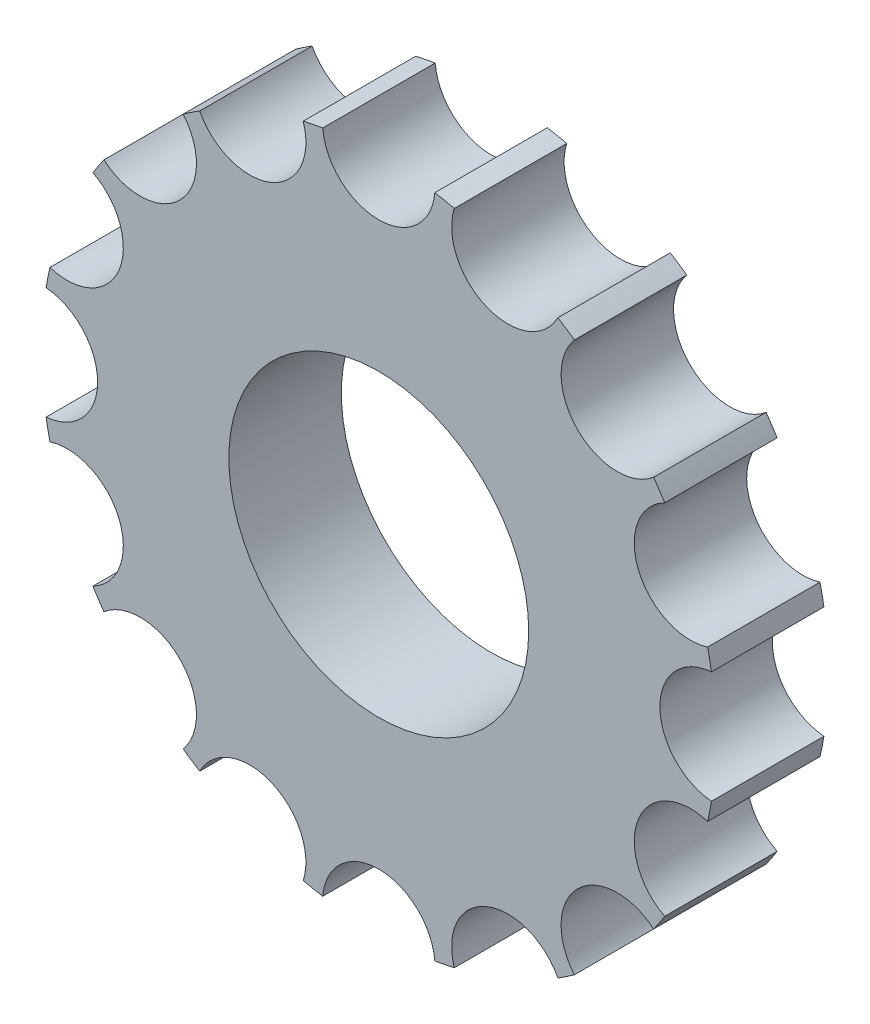
ISO-10303-21;
HEADER;
FILE_DESCRIPTION(('STEP AP214'),'2;1');
FILE_NAME('part.step','',(''),(''),'','','');
FILE_SCHEMA(('AUTOMOTIVE_DESIGN { 1 0 10303 214 1 1 1 1 }'));
ENDSEC;
DATA;
#1=APPLICATION_CONTEXT('core data for automotive mechanical design processes');
#2=APPLICATION_PROTOCOL_DEFINITION('international standard','automotive_design',2000,#1);
#3=PRODUCT_CONTEXT('',#1,'mechanical');
#4=PRODUCT('Part','Part','',(#3));
#5=PRODUCT_RELATED_PRODUCT_CATEGORY('part','',(#4));
#6=PRODUCT_DEFINITION_FORMATION('','',#4);
#7=PRODUCT_DEFINITION_CONTEXT('part definition',#1,'design');
#8=PRODUCT_DEFINITION('design','',#6,#7);
#9=PRODUCT_DEFINITION_SHAPE('','',#8);
#10=(LENGTH_UNIT() NAMED_UNIT(*) SI_UNIT(.MILLI.,.METRE.));
#11=(NAMED_UNIT(*) PLANE_ANGLE_UNIT() SI_UNIT($,.RADIAN.));
#12=(NAMED_UNIT(*) SI_UNIT($,.STERADIAN.) SOLID_ANGLE_UNIT());
#13=UNCERTAINTY_MEASURE_WITH_UNIT(LENGTH_MEASURE(1.E-05),#10,'distance_accuracy_value','');
#14=(GEOMETRIC_REPRESENTATION_CONTEXT(3) GLOBAL_UNCERTAINTY_ASSIGNED_CONTEXT((#13)) GLOBAL_UNIT_ASSIGNED_CONTEXT((#10,
#11,#12)) REPRESENTATION_CONTEXT('',''));
#15=CARTESIAN_POINT('',(0.,0.,0.));
#16=DIRECTION('',(0.,0.,1.));
#17=DIRECTION('',(1.,0.,0.));
#18=AXIS2_PLACEMENT_3D('',#15,#16,#17);
#19=CARTESIAN_POINT('',(0.,0.,15.));
#20=DIRECTION('',(0.,0.,-1.));
#21=DIRECTION('',(-1.,0.,0.));
#22=AXIS2_PLACEMENT_3D('',#19,#20,#21);
#23=CYLINDRICAL_SURFACE('',#22,45.);
#24=CARTESIAN_POINT('',(0.,0.,0.));
#25=DIRECTION('',(0.,0.,1.));
#26=DIRECTION('',(1.,0.,0.));
#27=AXIS2_PLACEMENT_3D('',#24,#25,#26);
#28=CIRCLE('',#27,45.);
#29=CARTESIAN_POINT('',(38.137011588755,23.8865725268229,0.));
#30=VERTEX_POINT('',#29);
#31=CARTESIAN_POINT('',(36.6627179543041,26.0930088760026,0.));
#32=VERTEX_POINT('',#31);
#33=EDGE_CURVE('E383',#30,#32,#28,.T.);
#34=ORIENTED_EDGE('',*,*,#33,.T.);
#35=DIRECTION('',(0.,0.,1.));
#36=VECTOR('',#35,1.);
#37=CARTESIAN_POINT('',(36.6627179543041,26.0930088760026,7.5));
#38=LINE('',#37,#36);
#39=CARTESIAN_POINT('',(36.6627179543041,26.0930088760026,15.));
#40=VERTEX_POINT('',#39);
#41=EDGE_CURVE('E11',#32,#40,#38,.T.);
#42=ORIENTED_EDGE('',*,*,#41,.T.);
#43=CARTESIAN_POINT('',(0.,0.,15.));
#44=DIRECTION('',(0.,0.,1.));
#45=DIRECTION('',(1.,0.,0.));
#46=AXIS2_PLACEMENT_3D('',#43,#44,#45);
#47=CIRCLE('',#46,45.);
#48=CARTESIAN_POINT('',(38.137011588755,23.8865725268229,15.));
#49=VERTEX_POINT('',#48);
#50=EDGE_CURVE('E529',#49,#40,#47,.T.);
#51=ORIENTED_EDGE('',*,*,#50,.F.);
#52=DIRECTION('',(0.,0.,1.));
#53=VECTOR('',#52,1.);
#54=CARTESIAN_POINT('',(38.137011588755,23.8865725268229,7.5));
#55=LINE('',#54,#53);
#56=EDGE_CURVE('E364',#49,#30,#55,.F.);
#57=ORIENTED_EDGE('',*,*,#56,.T.);
#58=EDGE_LOOP('',(#34,#42,#51,#57));
#59=FACE_BOUND('',#58,.T.);
#60=ADVANCED_FACE('F33',(#59),#23,.T.);
#61=CARTESIAN_POINT('',(44.3749999999976,7.47391296445249,0.));
#62=VERTEX_POINT('',#61);
#63=CARTESIAN_POINT('',(43.8572969216168,10.0765820955886,0.));
#64=VERTEX_POINT('',#63);
#65=EDGE_CURVE('E384',#62,#64,#28,.T.);
#66=ORIENTED_EDGE('',*,*,#65,.T.);
#67=DIRECTION('',(0.,0.,1.));
#68=VECTOR('',#67,1.);
#69=CARTESIAN_POINT('',(43.8572969216168,10.0765820955886,7.5));
#70=LINE('',#69,#68);
#71=CARTESIAN_POINT('',(43.8572969216168,10.0765820955886,15.));
#72=VERTEX_POINT('',#71);
#73=EDGE_CURVE('E367',#64,#72,#70,.T.);
#74=ORIENTED_EDGE('',*,*,#73,.T.);
#75=CARTESIAN_POINT('',(44.3749999999976,7.47391296445249,15.));
#76=VERTEX_POINT('',#75);
#77=EDGE_CURVE('E531',#76,#72,#47,.T.);
#78=ORIENTED_EDGE('',*,*,#77,.F.);
#79=DIRECTION('',(0.,0.,1.));
#80=VECTOR('',#79,1.);
#81=CARTESIAN_POINT('',(44.3749999999976,7.47391296445248,7.5));
#82=LINE('',#81,#80);
#83=EDGE_CURVE('E335',#76,#62,#82,.F.);
#84=ORIENTED_EDGE('',*,*,#83,.T.);
#85=EDGE_LOOP('',(#66,#74,#78,#84));
#86=FACE_BOUND('',#85,.T.);
#87=ADVANCED_FACE('F467',(#86),#23,.T.);
#88=CARTESIAN_POINT('',(26.0930088759983,36.6627179543071,15.));
#89=VERTEX_POINT('',#88);
#90=CARTESIAN_POINT('',(23.8865725268151,38.1370115887598,15.));
#91=VERTEX_POINT('',#90);
#92=EDGE_CURVE('E376',#89,#91,#47,.T.);
#93=ORIENTED_EDGE('',*,*,#92,.F.);
#94=DIRECTION('',(0.,0.,1.));
#95=VECTOR('',#94,1.);
#96=CARTESIAN_POINT('',(26.0930088759983,36.6627179543071,7.5));
#97=LINE('',#96,#95);
#98=CARTESIAN_POINT('',(26.0930088759983,36.6627179543071,0.));
#99=VERTEX_POINT('',#98);
#100=EDGE_CURVE('E41',#89,#99,#97,.F.);
#101=ORIENTED_EDGE('',*,*,#100,.T.);
#102=CARTESIAN_POINT('',(23.8865725268151,38.1370115887598,0.));
#103=VERTEX_POINT('',#102);
#104=EDGE_CURVE('E374',#99,#103,#28,.T.);
#105=ORIENTED_EDGE('',*,*,#104,.T.);
#106=DIRECTION('',(0.,0.,1.));
#107=VECTOR('',#106,1.);
#108=CARTESIAN_POINT('',(23.8865725268151,38.1370115887598,7.5));
#109=LINE('',#108,#107);
#110=EDGE_CURVE('E361',#103,#91,#109,.T.);
#111=ORIENTED_EDGE('',*,*,#110,.T.);
#112=EDGE_LOOP('',(#93,#101,#105,#111));
#113=FACE_BOUND('',#112,.T.);
#114=ADVANCED_FACE('F373',(#113),#23,.T.);
#115=CARTESIAN_POINT('',(23.8865725268439,-38.1370115887418,0.));
#116=VERTEX_POINT('',#115);
#117=CARTESIAN_POINT('',(26.0930088760029,-36.6627179543039,0.));
#118=VERTEX_POINT('',#117);
#119=EDGE_CURVE('E476',#116,#118,#28,.T.);
#120=ORIENTED_EDGE('',*,*,#119,.T.);
#121=DIRECTION('',(0.,0.,1.));
#122=VECTOR('',#121,1.);
#123=CARTESIAN_POINT('',(26.0930088760029,-36.6627179543039,7.5));
#124=LINE('',#123,#122);
#125=CARTESIAN_POINT('',(26.0930088760029,-36.6627179543039,15.));
#126=VERTEX_POINT('',#125);
#127=EDGE_CURVE('E356',#118,#126,#124,.T.);
#128=ORIENTED_EDGE('',*,*,#127,.T.);
#129=CARTESIAN_POINT('',(23.8865725268439,-38.1370115887418,15.));
#130=VERTEX_POINT('',#129);
#131=EDGE_CURVE('E541',#130,#126,#47,.T.);
#132=ORIENTED_EDGE('',*,*,#131,.F.);
#133=DIRECTION('',(0.,0.,1.));
#134=VECTOR('',#133,1.);
#135=CARTESIAN_POINT('',(23.8865725268439,-38.1370115887418,7.5));
#136=LINE('',#135,#134);
#137=EDGE_CURVE('E347',#130,#116,#136,.F.);
#138=ORIENTED_EDGE('',*,*,#137,.T.);
#139=EDGE_LOOP('',(#120,#128,#132,#138));
#140=FACE_BOUND('',#139,.T.);
#141=ADVANCED_FACE('F572',(#140),#23,.T.);
#142=CARTESIAN_POINT('',(7.47391296447325,-44.3749999999941,0.));
#143=VERTEX_POINT('',#142);
#144=CARTESIAN_POINT('',(10.0765820955872,-43.8572969216172,0.));
#145=VERTEX_POINT('',#144);
#146=EDGE_CURVE('E480',#143,#145,#28,.T.);
#147=ORIENTED_EDGE('',*,*,#146,.T.);
#148=DIRECTION('',(0.,0.,1.));
#149=VECTOR('',#148,1.);
#150=CARTESIAN_POINT('',(10.0765820955872,-43.8572969216172,7.5));
#151=LINE('',#150,#149);
#152=CARTESIAN_POINT('',(10.0765820955872,-43.8572969216172,15.));
#153=VERTEX_POINT('',#152);
#154=EDGE_CURVE('E350',#145,#153,#151,.T.);
#155=ORIENTED_EDGE('',*,*,#154,.T.);
#156=CARTESIAN_POINT('',(7.47391296447325,-44.3749999999941,15.));
#157=VERTEX_POINT('',#156);
#158=EDGE_CURVE('E545',#157,#153,#47,.T.);
#159=ORIENTED_EDGE('',*,*,#158,.F.);
#160=DIRECTION('',(0.,0.,1.));
#161=VECTOR('',#160,1.);
#162=CARTESIAN_POINT('',(7.47391296447325,-44.3749999999941,7.5));
#163=LINE('',#162,#161);
#164=EDGE_CURVE('E311',#157,#143,#163,.F.);
#165=ORIENTED_EDGE('',*,*,#164,.T.);
#166=EDGE_LOOP('',(#147,#155,#159,#165));
#167=FACE_BOUND('',#166,.T.);
#168=ADVANCED_FACE('F635',(#167),#23,.T.);
#169=CARTESIAN_POINT('',(36.6627179543216,-26.093008875978,15.));
#170=VERTEX_POINT('',#169);
#171=CARTESIAN_POINT('',(38.1370115887609,-23.8865725268133,15.));
#172=VERTEX_POINT('',#171);
#173=EDGE_CURVE('E537',#170,#172,#47,.T.);
#174=ORIENTED_EDGE('',*,*,#173,.F.);
#175=DIRECTION('',(0.,0.,1.));
#176=VECTOR('',#175,1.);
#177=CARTESIAN_POINT('',(36.6627179543216,-26.093008875978,7.5));
#178=LINE('',#177,#176);
#179=CARTESIAN_POINT('',(36.6627179543216,-26.093008875978,0.));
#180=VERTEX_POINT('',#179);
#181=EDGE_CURVE('E353',#170,#180,#178,.F.);
#182=ORIENTED_EDGE('',*,*,#181,.T.);
#183=CARTESIAN_POINT('',(38.1370115887609,-23.8865725268133,0.));
#184=VERTEX_POINT('',#183);
#185=EDGE_CURVE('E472',#180,#184,#28,.T.);
#186=ORIENTED_EDGE('',*,*,#185,.T.);
#187=DIRECTION('',(0.,0.,1.));
#188=VECTOR('',#187,1.);
#189=CARTESIAN_POINT('',(38.1370115887609,-23.8865725268133,7.5));
#190=LINE('',#189,#188);
#191=EDGE_CURVE('E344',#184,#172,#190,.T.);
#192=ORIENTED_EDGE('',*,*,#191,.T.);
#193=EDGE_LOOP('',(#174,#182,#186,#192));
#194=FACE_BOUND('',#193,.T.);
#195=ADVANCED_FACE('F631',(#194),#23,.T.);
#196=CARTESIAN_POINT('',(43.8572969216223,-10.0765820955647,15.));
#197=VERTEX_POINT('',#196);
#198=CARTESIAN_POINT('',(44.3750000000006,-7.47391296443484,15.));
#199=VERTEX_POINT('',#198);
#200=EDGE_CURVE('E534',#197,#199,#47,.T.);
#201=ORIENTED_EDGE('',*,*,#200,.F.);
#202=DIRECTION('',(0.,0.,1.));
#203=VECTOR('',#202,1.);
#204=CARTESIAN_POINT('',(43.8572969216223,-10.0765820955647,7.5));
#205=LINE('',#204,#203);
#206=CARTESIAN_POINT('',(43.8572969216223,-10.0765820955647,0.));
#207=VERTEX_POINT('',#206);
#208=EDGE_CURVE('E341',#197,#207,#205,.F.);
#209=ORIENTED_EDGE('',*,*,#208,.T.);
#210=CARTESIAN_POINT('',(44.3750000000006,-7.47391296443484,0.));
#211=VERTEX_POINT('',#210);
#212=EDGE_CURVE('E470',#207,#211,#28,.T.);
#213=ORIENTED_EDGE('',*,*,#212,.T.);
#214=DIRECTION('',(0.,0.,1.));
#215=VECTOR('',#214,1.);
#216=CARTESIAN_POINT('',(44.3750000000006,-7.47391296443484,7.5));
#217=LINE('',#216,#215);
#218=EDGE_CURVE('E338',#211,#199,#217,.T.);
#219=ORIENTED_EDGE('',*,*,#218,.T.);
#220=EDGE_LOOP('',(#201,#209,#213,#219));
#221=FACE_BOUND('',#220,.T.);
#222=ADVANCED_FACE('F577',(#221),#23,.T.);
#223=CARTESIAN_POINT('',(-38.1370115887443,-23.8865725268398,0.));
#224=VERTEX_POINT('',#223);
#225=CARTESIAN_POINT('',(-36.6627179543067,-26.0930088759989,0.));
#226=VERTEX_POINT('',#225);
#227=EDGE_CURVE('E492',#224,#226,#28,.T.);
#228=ORIENTED_EDGE('',*,*,#227,.T.);
#229=DIRECTION('',(0.,0.,1.));
#230=VECTOR('',#229,1.);
#231=CARTESIAN_POINT('',(-36.6627179543067,-26.0930088759989,7.5));
#232=LINE('',#231,#230);
#233=CARTESIAN_POINT('',(-36.6627179543067,-26.0930088759989,15.));
#234=VERTEX_POINT('',#233);
#235=EDGE_CURVE('E332',#226,#234,#232,.T.);
#236=ORIENTED_EDGE('',*,*,#235,.T.);
#237=CARTESIAN_POINT('',(-38.1370115887443,-23.8865725268398,15.));
#238=VERTEX_POINT('',#237);
#239=EDGE_CURVE('E275',#238,#234,#47,.T.);
#240=ORIENTED_EDGE('',*,*,#239,.F.);
#241=DIRECTION('',(0.,0.,1.));
#242=VECTOR('',#241,1.);
#243=CARTESIAN_POINT('',(-38.1370115887443,-23.8865725268398,7.5));
#244=LINE('',#243,#242);
#245=EDGE_CURVE('E323',#238,#224,#244,.F.);
#246=ORIENTED_EDGE('',*,*,#245,.T.);
#247=EDGE_LOOP('',(#228,#236,#240,#246));
#248=FACE_BOUND('',#247,.T.);
#249=ADVANCED_FACE('F562',(#248),#23,.T.);
#250=CARTESIAN_POINT('',(-44.3749999999964,-7.47391296445945,0.));
#251=VERTEX_POINT('',#250);
#252=CARTESIAN_POINT('',(-43.8572969216182,-10.0765820955825,0.));
#253=VERTEX_POINT('',#252);
#254=EDGE_CURVE('E496',#251,#253,#28,.T.);
#255=ORIENTED_EDGE('',*,*,#254,.T.);
#256=DIRECTION('',(0.,0.,1.));
#257=VECTOR('',#256,1.);
#258=CARTESIAN_POINT('',(-43.8572969216182,-10.0765820955825,7.5));
#259=LINE('',#258,#257);
#260=CARTESIAN_POINT('',(-43.8572969216182,-10.0765820955825,15.));
#261=VERTEX_POINT('',#260);
#262=EDGE_CURVE('E326',#253,#261,#259,.T.);
#263=ORIENTED_EDGE('',*,*,#262,.T.);
#264=CARTESIAN_POINT('',(-44.3749999999964,-7.47391296445945,15.));
#265=VERTEX_POINT('',#264);
#266=EDGE_CURVE('E272',#265,#261,#47,.T.);
#267=ORIENTED_EDGE('',*,*,#266,.F.);
#268=DIRECTION('',(0.,0.,1.));
#269=VECTOR('',#268,1.);
#270=CARTESIAN_POINT('',(-44.3749999999964,-7.47391296445945,7.5));
#271=LINE('',#270,#269);
#272=EDGE_CURVE('E247',#265,#251,#271,.F.);
#273=ORIENTED_EDGE('',*,*,#272,.T.);
#274=EDGE_LOOP('',(#255,#263,#267,#273));
#275=FACE_BOUND('',#274,.T.);
#276=ADVANCED_FACE('F621',(#275),#23,.T.);
#277=CARTESIAN_POINT('',(-26.093008875974,-36.6627179543244,15.));
#278=VERTEX_POINT('',#277);
#279=CARTESIAN_POINT('',(-23.886572526817,-38.1370115887586,15.));
#280=VERTEX_POINT('',#279);
#281=EDGE_CURVE('E553',#278,#280,#47,.T.);
#282=ORIENTED_EDGE('',*,*,#281,.F.);
#283=DIRECTION('',(0.,0.,1.));
#284=VECTOR('',#283,1.);
#285=CARTESIAN_POINT('',(-26.093008875974,-36.6627179543244,7.5));
#286=LINE('',#285,#284);
#287=CARTESIAN_POINT('',(-26.093008875974,-36.6627179543244,0.));
#288=VERTEX_POINT('',#287);
#289=EDGE_CURVE('E329',#278,#288,#286,.F.);
#290=ORIENTED_EDGE('',*,*,#289,.T.);
#291=CARTESIAN_POINT('',(-23.886572526817,-38.1370115887586,0.));
#292=VERTEX_POINT('',#291);
#293=EDGE_CURVE('E488',#288,#292,#28,.T.);
#294=ORIENTED_EDGE('',*,*,#293,.T.);
#295=DIRECTION('',(0.,0.,1.));
#296=VECTOR('',#295,1.);
#297=CARTESIAN_POINT('',(-23.886572526817,-38.1370115887586,7.5));
#298=LINE('',#297,#296);
#299=EDGE_CURVE('E320',#292,#280,#298,.T.);
#300=ORIENTED_EDGE('',*,*,#299,.T.);
#301=EDGE_LOOP('',(#282,#290,#294,#300));
#302=FACE_BOUND('',#301,.T.);
#303=ADVANCED_FACE('F617',(#302),#23,.T.);
#304=CARTESIAN_POINT('',(-10.076582095551,-43.8572969216255,15.));
#305=VERTEX_POINT('',#304);
#306=CARTESIAN_POINT('',(-7.47391296443796,-44.3750000000001,15.));
#307=VERTEX_POINT('',#306);
#308=EDGE_CURVE('E549',#305,#307,#47,.T.);
#309=ORIENTED_EDGE('',*,*,#308,.F.);
#310=DIRECTION('',(0.,0.,1.));
#311=VECTOR('',#310,1.);
#312=CARTESIAN_POINT('',(-10.076582095551,-43.8572969216255,7.5));
#313=LINE('',#312,#311);
#314=CARTESIAN_POINT('',(-10.076582095551,-43.8572969216255,0.));
#315=VERTEX_POINT('',#314);
#316=EDGE_CURVE('E317',#305,#315,#313,.F.);
#317=ORIENTED_EDGE('',*,*,#316,.T.);
#318=CARTESIAN_POINT('',(-7.47391296443796,-44.3750000000001,0.));
#319=VERTEX_POINT('',#318);
#320=EDGE_CURVE('E484',#315,#319,#28,.T.);
#321=ORIENTED_EDGE('',*,*,#320,.T.);
#322=DIRECTION('',(0.,0.,1.));
#323=VECTOR('',#322,1.);
#324=CARTESIAN_POINT('',(-7.47391296443796,-44.3750000000001,7.5));
#325=LINE('',#324,#323);
#326=EDGE_CURVE('E314',#319,#307,#325,.T.);
#327=ORIENTED_EDGE('',*,*,#326,.T.);
#328=EDGE_LOOP('',(#309,#317,#321,#327));
#329=FACE_BOUND('',#328,.T.);
#330=ADVANCED_FACE('F567',(#329),#23,.T.);
#331=CARTESIAN_POINT('',(-23.886572526819,38.1370115887574,0.));
#332=VERTEX_POINT('',#331);
#333=CARTESIAN_POINT('',(-26.0930088759983,36.6627179543071,0.));
#334=VERTEX_POINT('',#333);
#335=EDGE_CURVE('E287',#332,#334,#28,.T.);
#336=ORIENTED_EDGE('',*,*,#335,.T.);
#337=DIRECTION('',(0.,0.,1.));
#338=VECTOR('',#337,1.);
#339=CARTESIAN_POINT('',(-26.0930088759983,36.6627179543071,7.5));
#340=LINE('',#339,#338);
#341=CARTESIAN_POINT('',(-26.0930088759983,36.6627179543071,15.));
#342=VERTEX_POINT('',#341);
#343=EDGE_CURVE('E308',#334,#342,#340,.T.);
#344=ORIENTED_EDGE('',*,*,#343,.T.);
#345=CARTESIAN_POINT('',(-23.886572526819,38.1370115887574,15.));
#346=VERTEX_POINT('',#345);
#347=EDGE_CURVE('E274',#346,#342,#47,.T.);
#348=ORIENTED_EDGE('',*,*,#347,.F.);
#349=DIRECTION('',(0.,0.,1.));
#350=VECTOR('',#349,1.);
#351=CARTESIAN_POINT('',(-23.886572526819,38.1370115887574,7.5));
#352=LINE('',#351,#350);
#353=EDGE_CURVE('E299',#346,#332,#352,.F.);
#354=ORIENTED_EDGE('',*,*,#353,.T.);
#355=EDGE_LOOP('',(#336,#344,#348,#354));
#356=FACE_BOUND('',#355,.T.);
#357=ADVANCED_FACE('F509',(#356),#23,.T.);
#358=CARTESIAN_POINT('',(-7.47391296443837,44.375,0.));
#359=VERTEX_POINT('',#358);
#360=CARTESIAN_POINT('',(-10.0765820955837,43.857296921618,0.));
#361=VERTEX_POINT('',#360);
#362=EDGE_CURVE('E284',#359,#361,#28,.T.);
#363=ORIENTED_EDGE('',*,*,#362,.T.);
#364=DIRECTION('',(0.,0.,1.));
#365=VECTOR('',#364,1.);
#366=CARTESIAN_POINT('',(-10.0765820955837,43.857296921618,7.5));
#367=LINE('',#366,#365);
#368=CARTESIAN_POINT('',(-10.0765820955837,43.857296921618,15.));
#369=VERTEX_POINT('',#368);
#370=EDGE_CURVE('E302',#361,#369,#367,.T.);
#371=ORIENTED_EDGE('',*,*,#370,.T.);
#372=CARTESIAN_POINT('',(-7.47391296443837,44.375,15.));
#373=VERTEX_POINT('',#372);
#374=EDGE_CURVE('E276',#373,#369,#47,.T.);
#375=ORIENTED_EDGE('',*,*,#374,.F.);
#376=DIRECTION('',(0.,0.,1.));
#377=VECTOR('',#376,1.);
#378=CARTESIAN_POINT('',(-7.47391296443837,44.375,7.5));
#379=LINE('',#378,#377);
#380=EDGE_CURVE('E280',#373,#359,#379,.F.);
#381=ORIENTED_EDGE('',*,*,#380,.T.);
#382=EDGE_LOOP('',(#363,#371,#375,#381));
#383=FACE_BOUND('',#382,.T.);
#384=ADVANCED_FACE('F524',(#383),#23,.T.);
#385=CARTESIAN_POINT('',(-36.6627179543101,26.093008875994,15.));
#386=VERTEX_POINT('',#385);
#387=CARTESIAN_POINT('',(-38.1370115887573,23.8865725268191,15.));
#388=VERTEX_POINT('',#387);
#389=EDGE_CURVE('E271',#386,#388,#47,.T.);
#390=ORIENTED_EDGE('',*,*,#389,.F.);
#391=DIRECTION('',(0.,0.,1.));
#392=VECTOR('',#391,1.);
#393=CARTESIAN_POINT('',(-36.6627179543101,26.093008875994,7.5));
#394=LINE('',#393,#392);
#395=CARTESIAN_POINT('',(-36.6627179543101,26.093008875994,0.));
#396=VERTEX_POINT('',#395);
#397=EDGE_CURVE('E305',#386,#396,#394,.F.);
#398=ORIENTED_EDGE('',*,*,#397,.T.);
#399=CARTESIAN_POINT('',(-38.1370115887573,23.8865725268191,0.));
#400=VERTEX_POINT('',#399);
#401=EDGE_CURVE('E502',#396,#400,#28,.T.);
#402=ORIENTED_EDGE('',*,*,#401,.T.);
#403=DIRECTION('',(0.,0.,1.));
#404=VECTOR('',#403,1.);
#405=CARTESIAN_POINT('',(-38.1370115887573,23.8865725268191,7.5));
#406=LINE('',#405,#404);
#407=EDGE_CURVE('E296',#400,#388,#406,.T.);
#408=ORIENTED_EDGE('',*,*,#407,.T.);
#409=EDGE_LOOP('',(#390,#398,#402,#408));
#410=FACE_BOUND('',#409,.T.);
#411=ADVANCED_FACE('F517',(#410),#23,.T.);
#412=CARTESIAN_POINT('',(-43.8572969216208,10.0765820955715,15.));
#413=VERTEX_POINT('',#412);
#414=CARTESIAN_POINT('',(-44.3749999999994,7.47391296444179,15.));
#415=VERTEX_POINT('',#414);
#416=EDGE_CURVE('E260',#413,#415,#47,.T.);
#417=ORIENTED_EDGE('',*,*,#416,.F.);
#418=DIRECTION('',(0.,0.,1.));
#419=VECTOR('',#418,1.);
#420=CARTESIAN_POINT('',(-43.8572969216208,10.0765820955715,7.5));
#421=LINE('',#420,#419);
#422=CARTESIAN_POINT('',(-43.8572969216208,10.0765820955715,0.));
#423=VERTEX_POINT('',#422);
#424=EDGE_CURVE('E263',#413,#423,#421,.F.);
#425=ORIENTED_EDGE('',*,*,#424,.T.);
#426=CARTESIAN_POINT('',(-44.3749999999994,7.47391296444179,0.));
#427=VERTEX_POINT('',#426);
#428=EDGE_CURVE('E262',#423,#427,#28,.T.);
#429=ORIENTED_EDGE('',*,*,#428,.T.);
#430=DIRECTION('',(0.,0.,1.));
#431=VECTOR('',#430,1.);
#432=CARTESIAN_POINT('',(-44.3749999999994,7.47391296444179,7.5));
#433=LINE('',#432,#431);
#434=EDGE_CURVE('E244',#427,#415,#433,.T.);
#435=ORIENTED_EDGE('',*,*,#434,.T.);
#436=EDGE_LOOP('',(#417,#425,#429,#435));
#437=FACE_BOUND('',#436,.T.);
#438=ADVANCED_FACE('F258',(#437),#23,.T.);
#439=CARTESIAN_POINT('',(0.,0.,15.));
#440=DIRECTION('',(0.,0.,1.));
#441=DIRECTION('',(1.,0.,0.));
#442=AXIS2_PLACEMENT_3D('',#439,#440,#441);
#443=PLANE('',#442);
#444=CARTESIAN_POINT('',(31.8198051533973,31.819805153401,15.));
#445=DIRECTION('',(0.,0.,1.));
#446=DIRECTION('',(1.,0.,0.));
#447=AXIS2_PLACEMENT_3D('',#444,#445,#446);
#448=CIRCLE('',#447,7.50000000000073);
#449=EDGE_CURVE('E457',#89,#40,#448,.T.);
#450=ORIENTED_EDGE('',*,*,#449,.F.);
#451=ORIENTED_EDGE('',*,*,#92,.T.);
#452=CARTESIAN_POINT('',(17.2207544564297,41.5745789630113,15.));
#453=DIRECTION('',(0.,0.,1.));
#454=DIRECTION('',(1.,0.,0.));
#455=AXIS2_PLACEMENT_3D('',#452,#453,#454);
#456=CIRCLE('',#455,7.49999999999971);
#457=CARTESIAN_POINT('',(10.0765820955854,43.8572969216176,15.));
#458=VERTEX_POINT('',#457);
#459=EDGE_CURVE('E454',#458,#91,#456,.T.);
#460=ORIENTED_EDGE('',*,*,#459,.F.);
#461=CARTESIAN_POINT('',(7.47391296443837,44.375,15.));
#462=VERTEX_POINT('',#461);
#463=EDGE_CURVE('E281',#458,#462,#47,.T.);
#464=ORIENTED_EDGE('',*,*,#463,.T.);
#465=CARTESIAN_POINT('',(0.,45.,15.));
#466=DIRECTION('',(0.,0.,1.));
#467=DIRECTION('',(1.,0.,0.));
#468=AXIS2_PLACEMENT_3D('',#465,#466,#467);
#469=CIRCLE('',#468,7.5);
#470=EDGE_CURVE('E394',#373,#462,#469,.T.);
#471=ORIENTED_EDGE('',*,*,#470,.F.);
#472=ORIENTED_EDGE('',*,*,#374,.T.);
#473=CARTESIAN_POINT('',(-17.2207544564284,41.5745789630045,15.));
#474=DIRECTION('',(0.,0.,1.));
#475=DIRECTION('',(1.,0.,0.));
#476=AXIS2_PLACEMENT_3D('',#473,#474,#475);
#477=CIRCLE('',#476,7.50000000000227);
#478=EDGE_CURVE('E410',#346,#369,#477,.T.);
#479=ORIENTED_EDGE('',*,*,#478,.F.);
#480=ORIENTED_EDGE('',*,*,#347,.T.);
#481=CARTESIAN_POINT('',(-31.819805153392,31.8198051533883,15.));
#482=DIRECTION('',(0.,0.,1.));
#483=DIRECTION('',(1.,0.,0.));
#484=AXIS2_PLACEMENT_3D('',#481,#482,#483);
#485=CIRCLE('',#484,7.50000000000489);
#486=EDGE_CURVE('E405',#386,#342,#485,.T.);
#487=ORIENTED_EDGE('',*,*,#486,.F.);
#488=ORIENTED_EDGE('',*,*,#389,.T.);
#489=CARTESIAN_POINT('',(-41.5745789630024,17.2207544564208,15.));
#490=DIRECTION('',(0.,0.,1.));
#491=DIRECTION('',(1.,0.,0.));
#492=AXIS2_PLACEMENT_3D('',#489,#490,#491);
#493=CIRCLE('',#492,7.50000000000815);
#494=EDGE_CURVE('E270',#413,#388,#493,.T.);
#495=ORIENTED_EDGE('',*,*,#494,.F.);
#496=ORIENTED_EDGE('',*,*,#416,.T.);
#497=CARTESIAN_POINT('',(-44.999999999991,-8.95283847057726E-12,15.));
#498=DIRECTION('',(0.,0.,1.));
#499=DIRECTION('',(1.,0.,0.));
#500=AXIS2_PLACEMENT_3D('',#497,#498,#499);
#501=CIRCLE('',#500,7.50000000001163);
#502=EDGE_CURVE('E241',#265,#415,#501,.T.);
#503=ORIENTED_EDGE('',*,*,#502,.F.);
#504=ORIENTED_EDGE('',*,*,#266,.T.);
#505=CARTESIAN_POINT('',(-41.5745789629955,-17.2207544564373,15.));
#506=DIRECTION('',(0.,0.,1.));
#507=DIRECTION('',(1.,0.,0.));
#508=AXIS2_PLACEMENT_3D('',#505,#506,#507);
#509=CIRCLE('',#508,7.50000000001471);
#510=EDGE_CURVE('E404',#238,#261,#509,.T.);
#511=ORIENTED_EDGE('',*,*,#510,.F.);
#512=ORIENTED_EDGE('',*,*,#239,.T.);
#513=CARTESIAN_POINT('',(-31.8198051533794,-31.819805153401,15.));
#514=DIRECTION('',(0.,0.,1.));
#515=DIRECTION('',(1.,0.,0.));
#516=AXIS2_PLACEMENT_3D('',#513,#514,#515);
#517=CIRCLE('',#516,7.50000000001683);
#518=EDGE_CURVE('E426',#278,#234,#517,.T.);
#519=ORIENTED_EDGE('',*,*,#518,.F.);
#520=ORIENTED_EDGE('',*,*,#281,.T.);
#521=CARTESIAN_POINT('',(-17.2207544564118,-41.5745789630113,15.));
#522=DIRECTION('',(0.,0.,1.));
#523=DIRECTION('',(1.,0.,0.));
#524=AXIS2_PLACEMENT_3D('',#521,#522,#523);
#525=CIRCLE('',#524,7.50000000001781);
#526=EDGE_CURVE('E414',#305,#280,#525,.T.);
#527=ORIENTED_EDGE('',*,*,#526,.F.);
#528=ORIENTED_EDGE('',*,*,#308,.T.);
#529=CARTESIAN_POINT('',(1.78946551199622E-11,-45.,15.));
#530=DIRECTION('',(0.,0.,1.));
#531=DIRECTION('',(1.,0.,0.));
#532=AXIS2_PLACEMENT_3D('',#529,#530,#531);
#533=CIRCLE('',#532,7.50000000001741);
#534=EDGE_CURVE('E420',#157,#307,#533,.T.);
#535=ORIENTED_EDGE('',*,*,#534,.F.);
#536=ORIENTED_EDGE('',*,*,#158,.T.);
#537=CARTESIAN_POINT('',(17.2207544564463,-41.5745789630045,15.));
#538=DIRECTION('',(0.,0.,1.));
#539=DIRECTION('',(1.,0.,0.));
#540=AXIS2_PLACEMENT_3D('',#537,#538,#539);
#541=CIRCLE('',#540,7.50000000001572);
#542=EDGE_CURVE('E425',#130,#153,#541,.T.);
#543=ORIENTED_EDGE('',*,*,#542,.F.);
#544=ORIENTED_EDGE('',*,*,#131,.T.);
#545=CARTESIAN_POINT('',(31.8198051534099,-31.8198051533883,15.));
#546=DIRECTION('',(0.,0.,1.));
#547=DIRECTION('',(1.,0.,0.));
#548=AXIS2_PLACEMENT_3D('',#545,#546,#547);
#549=CIRCLE('',#548,7.50000000001298);
#550=EDGE_CURVE('E446',#170,#126,#549,.T.);
#551=ORIENTED_EDGE('',*,*,#550,.F.);
#552=ORIENTED_EDGE('',*,*,#173,.T.);
#553=CARTESIAN_POINT('',(41.5745789630203,-17.2207544564208,15.));
#554=DIRECTION('',(0.,0.,1.));
#555=DIRECTION('',(1.,0.,0.));
#556=AXIS2_PLACEMENT_3D('',#553,#554,#555);
#557=CIRCLE('',#556,7.5000000000096);
#558=EDGE_CURVE('E434',#197,#172,#557,.T.);
#559=ORIENTED_EDGE('',*,*,#558,.F.);
#560=ORIENTED_EDGE('',*,*,#200,.T.);
#561=CARTESIAN_POINT('',(45.0000000000089,8.9473275599811E-12,15.));
#562=DIRECTION('',(0.,0.,1.));
#563=DIRECTION('',(1.,0.,0.));
#564=AXIS2_PLACEMENT_3D('',#561,#562,#563);
#565=CIRCLE('',#564,7.50000000000609);
#566=EDGE_CURVE('E440',#76,#199,#565,.T.);
#567=ORIENTED_EDGE('',*,*,#566,.F.);
#568=ORIENTED_EDGE('',*,*,#77,.T.);
#569=CARTESIAN_POINT('',(41.5745789630134,17.2207544564373,15.));
#570=DIRECTION('',(0.,0.,1.));
#571=DIRECTION('',(1.,0.,0.));
#572=AXIS2_PLACEMENT_3D('',#569,#570,#571);
#573=CIRCLE('',#572,7.50000000000298);
#574=EDGE_CURVE('E445',#49,#72,#573,.T.);
#575=ORIENTED_EDGE('',*,*,#574,.F.);
#576=ORIENTED_EDGE('',*,*,#50,.T.);
#577=EDGE_LOOP('',(#450,#451,#460,#464,#471,#472,#479,#480,#487,#488,#495,#496,#503,#504,#511,
#512,#519,#520,#527,#528,#535,#536,#543,#544,#551,#552,#559,#560,#567,#568,#575,#576));
#578=FACE_BOUND('',#577,.T.);
#579=CARTESIAN_POINT('',(0.,0.,15.));
#580=DIRECTION('',(0.,0.,1.));
#581=DIRECTION('',(1.,0.,0.));
#582=AXIS2_PLACEMENT_3D('',#579,#580,#581);
#583=CIRCLE('',#582,20.);
#584=CARTESIAN_POINT('',(20.,0.,15.));
#585=VERTEX_POINT('',#584);
#586=EDGE_CURVE('E385',#585,#585,#583,.T.);
#587=ORIENTED_EDGE('',*,*,#586,.F.);
#588=EDGE_LOOP('',(#587));
#589=FACE_BOUND('',#588,.T.);
#590=ADVANCED_FACE('F267',(#578,#589),#443,.T.);
#591=CARTESIAN_POINT('',(0.,0.,0.));
#592=DIRECTION('',(0.,0.,1.));
#593=DIRECTION('',(1.,0.,0.));
#594=AXIS2_PLACEMENT_3D('',#591,#592,#593);
#595=PLANE('',#594);
#596=ORIENTED_EDGE('',*,*,#104,.F.);
#597=CARTESIAN_POINT('',(31.8198051533973,31.819805153401,0.));
#598=DIRECTION('',(0.,0.,1.));
#599=DIRECTION('',(1.,0.,0.));
#600=AXIS2_PLACEMENT_3D('',#597,#598,#599);
#601=CIRCLE('',#600,7.50000000000073);
#602=EDGE_CURVE('E56',#99,#32,#601,.T.);
#603=ORIENTED_EDGE('',*,*,#602,.T.);
#604=ORIENTED_EDGE('',*,*,#33,.F.);
#605=CARTESIAN_POINT('',(41.5745789630134,17.2207544564373,0.));
#606=DIRECTION('',(0.,0.,1.));
#607=DIRECTION('',(1.,0.,0.));
#608=AXIS2_PLACEMENT_3D('',#605,#606,#607);
#609=CIRCLE('',#608,7.50000000000298);
#610=EDGE_CURVE('E459',#30,#64,#609,.T.);
#611=ORIENTED_EDGE('',*,*,#610,.T.);
#612=ORIENTED_EDGE('',*,*,#65,.F.);
#613=CARTESIAN_POINT('',(45.0000000000089,8.9473275599811E-12,0.));
#614=DIRECTION('',(0.,0.,1.));
#615=DIRECTION('',(1.,0.,0.));
#616=AXIS2_PLACEMENT_3D('',#613,#614,#615);
#617=CIRCLE('',#616,7.50000000000609);
#618=EDGE_CURVE('E442',#62,#211,#617,.T.);
#619=ORIENTED_EDGE('',*,*,#618,.T.);
#620=ORIENTED_EDGE('',*,*,#212,.F.);
#621=CARTESIAN_POINT('',(41.5745789630203,-17.2207544564208,0.));
#622=DIRECTION('',(0.,0.,1.));
#623=DIRECTION('',(1.,0.,0.));
#624=AXIS2_PLACEMENT_3D('',#621,#622,#623);
#625=CIRCLE('',#624,7.5000000000096);
#626=EDGE_CURVE('E436',#207,#184,#625,.T.);
#627=ORIENTED_EDGE('',*,*,#626,.T.);
#628=ORIENTED_EDGE('',*,*,#185,.F.);
#629=CARTESIAN_POINT('',(31.8198051534099,-31.8198051533883,0.));
#630=DIRECTION('',(0.,0.,1.));
#631=DIRECTION('',(1.,0.,0.));
#632=AXIS2_PLACEMENT_3D('',#629,#630,#631);
#633=CIRCLE('',#632,7.50000000001298);
#634=EDGE_CURVE('E437',#180,#118,#633,.T.);
#635=ORIENTED_EDGE('',*,*,#634,.T.);
#636=ORIENTED_EDGE('',*,*,#119,.F.);
#637=CARTESIAN_POINT('',(17.2207544564463,-41.5745789630045,0.));
#638=DIRECTION('',(0.,0.,1.));
#639=DIRECTION('',(1.,0.,0.));
#640=AXIS2_PLACEMENT_3D('',#637,#638,#639);
#641=CIRCLE('',#640,7.50000000001572);
#642=EDGE_CURVE('E448',#116,#145,#641,.T.);
#643=ORIENTED_EDGE('',*,*,#642,.T.);
#644=ORIENTED_EDGE('',*,*,#146,.F.);
#645=CARTESIAN_POINT('',(1.78946551199622E-11,-45.,0.));
#646=DIRECTION('',(0.,0.,1.));
#647=DIRECTION('',(1.,0.,0.));
#648=AXIS2_PLACEMENT_3D('',#645,#646,#647);
#649=CIRCLE('',#648,7.50000000001741);
#650=EDGE_CURVE('E422',#143,#319,#649,.T.);
#651=ORIENTED_EDGE('',*,*,#650,.T.);
#652=ORIENTED_EDGE('',*,*,#320,.F.);
#653=CARTESIAN_POINT('',(-17.2207544564118,-41.5745789630113,0.));
#654=DIRECTION('',(0.,0.,1.));
#655=DIRECTION('',(1.,0.,0.));
#656=AXIS2_PLACEMENT_3D('',#653,#654,#655);
#657=CIRCLE('',#656,7.50000000001781);
#658=EDGE_CURVE('E416',#315,#292,#657,.T.);
#659=ORIENTED_EDGE('',*,*,#658,.T.);
#660=ORIENTED_EDGE('',*,*,#293,.F.);
#661=CARTESIAN_POINT('',(-31.8198051533794,-31.819805153401,0.));
#662=DIRECTION('',(0.,0.,1.));
#663=DIRECTION('',(1.,0.,0.));
#664=AXIS2_PLACEMENT_3D('',#661,#662,#663);
#665=CIRCLE('',#664,7.50000000001683);
#666=EDGE_CURVE('E417',#288,#226,#665,.T.);
#667=ORIENTED_EDGE('',*,*,#666,.T.);
#668=ORIENTED_EDGE('',*,*,#227,.F.);
#669=CARTESIAN_POINT('',(-41.5745789629955,-17.2207544564373,0.));
#670=DIRECTION('',(0.,0.,1.));
#671=DIRECTION('',(1.,0.,0.));
#672=AXIS2_PLACEMENT_3D('',#669,#670,#671);
#673=CIRCLE('',#672,7.50000000001471);
#674=EDGE_CURVE('E428',#224,#253,#673,.T.);
#675=ORIENTED_EDGE('',*,*,#674,.T.);
#676=ORIENTED_EDGE('',*,*,#254,.F.);
#677=CARTESIAN_POINT('',(-44.999999999991,-8.95283847057726E-12,0.));
#678=DIRECTION('',(0.,0.,1.));
#679=DIRECTION('',(1.,0.,0.));
#680=AXIS2_PLACEMENT_3D('',#677,#678,#679);
#681=CIRCLE('',#680,7.50000000001163);
#682=EDGE_CURVE('E252',#251,#427,#681,.T.);
#683=ORIENTED_EDGE('',*,*,#682,.T.);
#684=ORIENTED_EDGE('',*,*,#428,.F.);
#685=CARTESIAN_POINT('',(-41.5745789630024,17.2207544564208,0.));
#686=DIRECTION('',(0.,0.,1.));
#687=DIRECTION('',(1.,0.,0.));
#688=AXIS2_PLACEMENT_3D('',#685,#686,#687);
#689=CIRCLE('',#688,7.50000000000815);
#690=EDGE_CURVE('E253',#423,#400,#689,.T.);
#691=ORIENTED_EDGE('',*,*,#690,.T.);
#692=ORIENTED_EDGE('',*,*,#401,.F.);
#693=CARTESIAN_POINT('',(-31.819805153392,31.8198051533883,0.));
#694=DIRECTION('',(0.,0.,1.));
#695=DIRECTION('',(1.,0.,0.));
#696=AXIS2_PLACEMENT_3D('',#693,#694,#695);
#697=CIRCLE('',#696,7.50000000000489);
#698=EDGE_CURVE('E400',#396,#334,#697,.T.);
#699=ORIENTED_EDGE('',*,*,#698,.T.);
#700=ORIENTED_EDGE('',*,*,#335,.F.);
#701=CARTESIAN_POINT('',(-17.2207544564284,41.5745789630045,0.));
#702=DIRECTION('',(0.,0.,1.));
#703=DIRECTION('',(1.,0.,0.));
#704=AXIS2_PLACEMENT_3D('',#701,#702,#703);
#705=CIRCLE('',#704,7.50000000000227);
#706=EDGE_CURVE('E407',#332,#361,#705,.T.);
#707=ORIENTED_EDGE('',*,*,#706,.T.);
#708=ORIENTED_EDGE('',*,*,#362,.F.);
#709=CARTESIAN_POINT('',(0.,45.,0.));
#710=DIRECTION('',(0.,0.,1.));
#711=DIRECTION('',(1.,0.,0.));
#712=AXIS2_PLACEMENT_3D('',#709,#710,#711);
#713=CIRCLE('',#712,7.5);
#714=CARTESIAN_POINT('',(7.47391296443837,44.375,0.));
#715=VERTEX_POINT('',#714);
#716=EDGE_CURVE('E392',#359,#715,#713,.T.);
#717=ORIENTED_EDGE('',*,*,#716,.T.);
#718=CARTESIAN_POINT('',(10.0765820955854,43.8572969216176,0.));
#719=VERTEX_POINT('',#718);
#720=EDGE_CURVE('E288',#719,#715,#28,.T.);
#721=ORIENTED_EDGE('',*,*,#720,.F.);
#722=CARTESIAN_POINT('',(17.2207544564297,41.5745789630113,0.));
#723=DIRECTION('',(0.,0.,1.));
#724=DIRECTION('',(1.,0.,0.));
#725=AXIS2_PLACEMENT_3D('',#722,#723,#724);
#726=CIRCLE('',#725,7.49999999999971);
#727=EDGE_CURVE('E48',#719,#103,#726,.T.);
#728=ORIENTED_EDGE('',*,*,#727,.T.);
#729=EDGE_LOOP('',(#596,#603,#604,#611,#612,#619,#620,#627,#628,#635,#636,#643,#644,#651,#652,
#659,#660,#667,#668,#675,#676,#683,#684,#691,#692,#699,#700,#707,#708,#717,#721,#728));
#730=FACE_BOUND('',#729,.T.);
#731=CARTESIAN_POINT('',(0.,0.,0.));
#732=DIRECTION('',(0.,0.,1.));
#733=DIRECTION('',(1.,0.,0.));
#734=AXIS2_PLACEMENT_3D('',#731,#732,#733);
#735=CIRCLE('',#734,20.);
#736=CARTESIAN_POINT('',(20.,0.,0.));
#737=VERTEX_POINT('',#736);
#738=EDGE_CURVE('E282',#737,#737,#735,.T.);
#739=ORIENTED_EDGE('',*,*,#738,.T.);
#740=EDGE_LOOP('',(#739));
#741=FACE_BOUND('',#740,.T.);
#742=ADVANCED_FACE('F378',(#730,#741),#595,.F.);
#743=ORIENTED_EDGE('',*,*,#463,.F.);
#744=DIRECTION('',(0.,0.,1.));
#745=VECTOR('',#744,1.);
#746=CARTESIAN_POINT('',(10.0765820955854,43.8572969216176,7.5));
#747=LINE('',#746,#745);
#748=EDGE_CURVE('E359',#458,#719,#747,.F.);
#749=ORIENTED_EDGE('',*,*,#748,.T.);
#750=ORIENTED_EDGE('',*,*,#720,.T.);
#751=DIRECTION('',(0.,0.,1.));
#752=VECTOR('',#751,1.);
#753=CARTESIAN_POINT('',(7.47391296443837,44.375,7.5));
#754=LINE('',#753,#752);
#755=EDGE_CURVE('E291',#715,#462,#754,.T.);
#756=ORIENTED_EDGE('',*,*,#755,.T.);
#757=EDGE_LOOP('',(#743,#749,#750,#756));
#758=FACE_BOUND('',#757,.T.);
#759=ADVANCED_FACE('F35',(#758),#23,.T.);
#760=CARTESIAN_POINT('',(0.,0.,15.));
#761=DIRECTION('',(0.,0.,-1.));
#762=DIRECTION('',(-1.,0.,0.));
#763=AXIS2_PLACEMENT_3D('',#760,#761,#762);
#764=CYLINDRICAL_SURFACE('',#763,20.);
#765=ORIENTED_EDGE('',*,*,#586,.T.);
#766=EDGE_LOOP('',(#765));
#767=FACE_BOUND('',#766,.T.);
#768=ORIENTED_EDGE('',*,*,#738,.F.);
#769=EDGE_LOOP('',(#768));
#770=FACE_BOUND('',#769,.T.);
#771=ADVANCED_FACE('F596',(#767,#770),#764,.F.);
#772=CARTESIAN_POINT('',(0.,45.,0.));
#773=DIRECTION('',(0.,0.,1.));
#774=DIRECTION('',(1.,0.,0.));
#775=AXIS2_PLACEMENT_3D('',#772,#773,#774);
#776=CYLINDRICAL_SURFACE('',#775,7.5);
#777=ORIENTED_EDGE('',*,*,#716,.F.);
#778=ORIENTED_EDGE('',*,*,#380,.F.);
#779=ORIENTED_EDGE('',*,*,#470,.T.);
#780=ORIENTED_EDGE('',*,*,#755,.F.);
#781=EDGE_LOOP('',(#777,#778,#779,#780));
#782=FACE_BOUND('',#781,.T.);
#783=ADVANCED_FACE('F526',(#782),#776,.F.);
#784=CARTESIAN_POINT('',(-44.999999999991,-8.95283847057726E-12,0.));
#785=DIRECTION('',(0.,0.,1.));
#786=DIRECTION('',(1.,0.,0.));
#787=AXIS2_PLACEMENT_3D('',#784,#785,#786);
#788=CYLINDRICAL_SURFACE('',#787,7.50000000001163);
#789=ORIENTED_EDGE('',*,*,#682,.F.);
#790=ORIENTED_EDGE('',*,*,#272,.F.);
#791=ORIENTED_EDGE('',*,*,#502,.T.);
#792=ORIENTED_EDGE('',*,*,#434,.F.);
#793=EDGE_LOOP('',(#789,#790,#791,#792));
#794=FACE_BOUND('',#793,.T.);
#795=ADVANCED_FACE('F243',(#794),#788,.F.);
#796=CARTESIAN_POINT('',(-41.5745789630024,17.2207544564208,0.));
#797=DIRECTION('',(0.,0.,1.));
#798=DIRECTION('',(1.,0.,0.));
#799=AXIS2_PLACEMENT_3D('',#796,#797,#798);
#800=CYLINDRICAL_SURFACE('',#799,7.50000000000815);
#801=ORIENTED_EDGE('',*,*,#690,.F.);
#802=ORIENTED_EDGE('',*,*,#424,.F.);
#803=ORIENTED_EDGE('',*,*,#494,.T.);
#804=ORIENTED_EDGE('',*,*,#407,.F.);
#805=EDGE_LOOP('',(#801,#802,#803,#804));
#806=FACE_BOUND('',#805,.T.);
#807=ADVANCED_FACE('F677',(#806),#800,.F.);
#808=CARTESIAN_POINT('',(-17.2207544564284,41.5745789630045,0.));
#809=DIRECTION('',(0.,0.,1.));
#810=DIRECTION('',(1.,0.,0.));
#811=AXIS2_PLACEMENT_3D('',#808,#809,#810);
#812=CYLINDRICAL_SURFACE('',#811,7.50000000000227);
#813=ORIENTED_EDGE('',*,*,#706,.F.);
#814=ORIENTED_EDGE('',*,*,#353,.F.);
#815=ORIENTED_EDGE('',*,*,#478,.T.);
#816=ORIENTED_EDGE('',*,*,#370,.F.);
#817=EDGE_LOOP('',(#813,#814,#815,#816));
#818=FACE_BOUND('',#817,.T.);
#819=ADVANCED_FACE('F522',(#818),#812,.F.);
#820=CARTESIAN_POINT('',(-31.819805153392,31.8198051533883,0.));
#821=DIRECTION('',(0.,0.,1.));
#822=DIRECTION('',(1.,0.,0.));
#823=AXIS2_PLACEMENT_3D('',#820,#821,#822);
#824=CYLINDRICAL_SURFACE('',#823,7.50000000000489);
#825=ORIENTED_EDGE('',*,*,#698,.F.);
#826=ORIENTED_EDGE('',*,*,#397,.F.);
#827=ORIENTED_EDGE('',*,*,#486,.T.);
#828=ORIENTED_EDGE('',*,*,#343,.F.);
#829=EDGE_LOOP('',(#825,#826,#827,#828));
#830=FACE_BOUND('',#829,.T.);
#831=ADVANCED_FACE('F514',(#830),#824,.F.);
#832=CARTESIAN_POINT('',(1.78946551199622E-11,-45.,0.));
#833=DIRECTION('',(0.,0.,1.));
#834=DIRECTION('',(1.,0.,0.));
#835=AXIS2_PLACEMENT_3D('',#832,#833,#834);
#836=CYLINDRICAL_SURFACE('',#835,7.50000000001741);
#837=ORIENTED_EDGE('',*,*,#650,.F.);
#838=ORIENTED_EDGE('',*,*,#164,.F.);
#839=ORIENTED_EDGE('',*,*,#534,.T.);
#840=ORIENTED_EDGE('',*,*,#326,.F.);
#841=EDGE_LOOP('',(#837,#838,#839,#840));
#842=FACE_BOUND('',#841,.T.);
#843=ADVANCED_FACE('F569',(#842),#836,.F.);
#844=CARTESIAN_POINT('',(-17.2207544564118,-41.5745789630113,0.));
#845=DIRECTION('',(0.,0.,1.));
#846=DIRECTION('',(1.,0.,0.));
#847=AXIS2_PLACEMENT_3D('',#844,#845,#846);
#848=CYLINDRICAL_SURFACE('',#847,7.50000000001781);
#849=ORIENTED_EDGE('',*,*,#658,.F.);
#850=ORIENTED_EDGE('',*,*,#316,.F.);
#851=ORIENTED_EDGE('',*,*,#526,.T.);
#852=ORIENTED_EDGE('',*,*,#299,.F.);
#853=EDGE_LOOP('',(#849,#850,#851,#852));
#854=FACE_BOUND('',#853,.T.);
#855=ADVANCED_FACE('F566',(#854),#848,.F.);
#856=CARTESIAN_POINT('',(-41.5745789629955,-17.2207544564373,0.));
#857=DIRECTION('',(0.,0.,1.));
#858=DIRECTION('',(1.,0.,0.));
#859=AXIS2_PLACEMENT_3D('',#856,#857,#858);
#860=CYLINDRICAL_SURFACE('',#859,7.50000000001471);
#861=ORIENTED_EDGE('',*,*,#674,.F.);
#862=ORIENTED_EDGE('',*,*,#245,.F.);
#863=ORIENTED_EDGE('',*,*,#510,.T.);
#864=ORIENTED_EDGE('',*,*,#262,.F.);
#865=EDGE_LOOP('',(#861,#862,#863,#864));
#866=FACE_BOUND('',#865,.T.);
#867=ADVANCED_FACE('F587',(#866),#860,.F.);
#868=CARTESIAN_POINT('',(-31.8198051533794,-31.819805153401,0.));
#869=DIRECTION('',(0.,0.,1.));
#870=DIRECTION('',(1.,0.,0.));
#871=AXIS2_PLACEMENT_3D('',#868,#869,#870);
#872=CYLINDRICAL_SURFACE('',#871,7.50000000001683);
#873=ORIENTED_EDGE('',*,*,#666,.F.);
#874=ORIENTED_EDGE('',*,*,#289,.F.);
#875=ORIENTED_EDGE('',*,*,#518,.T.);
#876=ORIENTED_EDGE('',*,*,#235,.F.);
#877=EDGE_LOOP('',(#873,#874,#875,#876));
#878=FACE_BOUND('',#877,.T.);
#879=ADVANCED_FACE('F564',(#878),#872,.F.);
#880=CARTESIAN_POINT('',(45.0000000000089,8.9473275599811E-12,0.));
#881=DIRECTION('',(0.,0.,1.));
#882=DIRECTION('',(1.,0.,0.));
#883=AXIS2_PLACEMENT_3D('',#880,#881,#882);
#884=CYLINDRICAL_SURFACE('',#883,7.50000000000609);
#885=ORIENTED_EDGE('',*,*,#618,.F.);
#886=ORIENTED_EDGE('',*,*,#83,.F.);
#887=ORIENTED_EDGE('',*,*,#566,.T.);
#888=ORIENTED_EDGE('',*,*,#218,.F.);
#889=EDGE_LOOP('',(#885,#886,#887,#888));
#890=FACE_BOUND('',#889,.T.);
#891=ADVANCED_FACE('F579',(#890),#884,.F.);
#892=CARTESIAN_POINT('',(41.5745789630203,-17.2207544564208,0.));
#893=DIRECTION('',(0.,0.,1.));
#894=DIRECTION('',(1.,0.,0.));
#895=AXIS2_PLACEMENT_3D('',#892,#893,#894);
#896=CYLINDRICAL_SURFACE('',#895,7.5000000000096);
#897=ORIENTED_EDGE('',*,*,#626,.F.);
#898=ORIENTED_EDGE('',*,*,#208,.F.);
#899=ORIENTED_EDGE('',*,*,#558,.T.);
#900=ORIENTED_EDGE('',*,*,#191,.F.);
#901=EDGE_LOOP('',(#897,#898,#899,#900));
#902=FACE_BOUND('',#901,.T.);
#903=ADVANCED_FACE('F576',(#902),#896,.F.);
#904=CARTESIAN_POINT('',(17.2207544564463,-41.5745789630045,0.));
#905=DIRECTION('',(0.,0.,1.));
#906=DIRECTION('',(1.,0.,0.));
#907=AXIS2_PLACEMENT_3D('',#904,#905,#906);
#908=CYLINDRICAL_SURFACE('',#907,7.50000000001572);
#909=ORIENTED_EDGE('',*,*,#642,.F.);
#910=ORIENTED_EDGE('',*,*,#137,.F.);
#911=ORIENTED_EDGE('',*,*,#542,.T.);
#912=ORIENTED_EDGE('',*,*,#154,.F.);
#913=EDGE_LOOP('',(#909,#910,#911,#912));
#914=FACE_BOUND('',#913,.T.);
#915=ADVANCED_FACE('F571',(#914),#908,.F.);
#916=CARTESIAN_POINT('',(31.8198051534099,-31.8198051533883,0.));
#917=DIRECTION('',(0.,0.,1.));
#918=DIRECTION('',(1.,0.,0.));
#919=AXIS2_PLACEMENT_3D('',#916,#917,#918);
#920=CYLINDRICAL_SURFACE('',#919,7.50000000001298);
#921=ORIENTED_EDGE('',*,*,#634,.F.);
#922=ORIENTED_EDGE('',*,*,#181,.F.);
#923=ORIENTED_EDGE('',*,*,#550,.T.);
#924=ORIENTED_EDGE('',*,*,#127,.F.);
#925=EDGE_LOOP('',(#921,#922,#923,#924));
#926=FACE_BOUND('',#925,.T.);
#927=ADVANCED_FACE('F574',(#926),#920,.F.);
#928=CARTESIAN_POINT('',(17.2207544564297,41.5745789630113,0.));
#929=DIRECTION('',(0.,0.,1.));
#930=DIRECTION('',(1.,0.,0.));
#931=AXIS2_PLACEMENT_3D('',#928,#929,#930);
#932=CYLINDRICAL_SURFACE('',#931,7.49999999999971);
#933=ORIENTED_EDGE('',*,*,#727,.F.);
#934=ORIENTED_EDGE('',*,*,#748,.F.);
#935=ORIENTED_EDGE('',*,*,#459,.T.);
#936=ORIENTED_EDGE('',*,*,#110,.F.);
#937=EDGE_LOOP('',(#933,#934,#935,#936));
#938=FACE_BOUND('',#937,.T.);
#939=ADVANCED_FACE('F747',(#938),#932,.F.);
#940=CARTESIAN_POINT('',(41.5745789630134,17.2207544564373,0.));
#941=DIRECTION('',(0.,0.,1.));
#942=DIRECTION('',(1.,0.,0.));
#943=AXIS2_PLACEMENT_3D('',#940,#941,#942);
#944=CYLINDRICAL_SURFACE('',#943,7.50000000000298);
#945=ORIENTED_EDGE('',*,*,#610,.F.);
#946=ORIENTED_EDGE('',*,*,#56,.F.);
#947=ORIENTED_EDGE('',*,*,#574,.T.);
#948=ORIENTED_EDGE('',*,*,#73,.F.);
#949=EDGE_LOOP('',(#945,#946,#947,#948));
#950=FACE_BOUND('',#949,.T.);
#951=ADVANCED_FACE('F755',(#950),#944,.F.);
#952=CARTESIAN_POINT('',(31.8198051533973,31.819805153401,0.));
#953=DIRECTION('',(0.,0.,1.));
#954=DIRECTION('',(1.,0.,0.));
#955=AXIS2_PLACEMENT_3D('',#952,#953,#954);
#956=CYLINDRICAL_SURFACE('',#955,7.50000000000073);
#957=ORIENTED_EDGE('',*,*,#602,.F.);
#958=ORIENTED_EDGE('',*,*,#100,.F.);
#959=ORIENTED_EDGE('',*,*,#449,.T.);
#960=ORIENTED_EDGE('',*,*,#41,.F.);
#961=EDGE_LOOP('',(#957,#958,#959,#960));
#962=FACE_BOUND('',#961,.T.);
#963=ADVANCED_FACE('F764',(#962),#956,.F.);
#964=CLOSED_SHELL('',(#60,#87,#114,#141,#168,#195,#222,#249,#276,#303,#330,#357,#384,#411,#438,
#590,#742,#759,#771,#783,#795,#807,#819,#831,#843,#855,#867,#879,#891,#903,#915,#927,#939,#951,#963));
#965=MANIFOLD_SOLID_BREP('B2',#964);
#966=ADVANCED_BREP_SHAPE_REPRESENTATION('',(#18,#965),#14);
#967=SHAPE_DEFINITION_REPRESENTATION(#9,#966);
ENDSEC;
END-ISO-10303-21;
